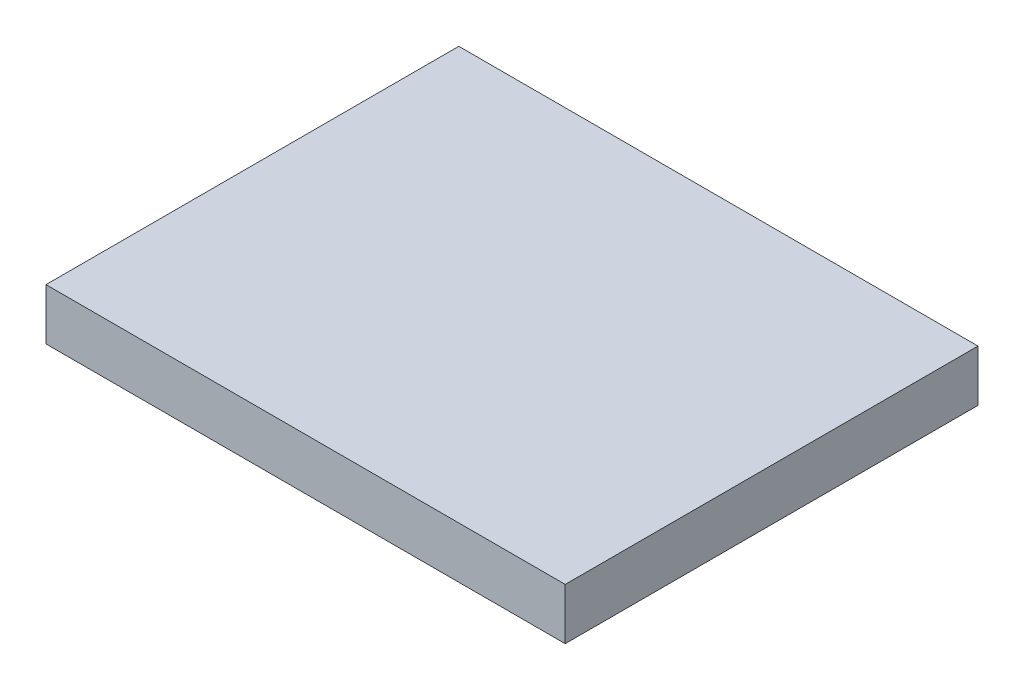
ISO-10303-21;
HEADER;
FILE_DESCRIPTION(('STEP AP214'),'2;1');
FILE_NAME('part.step','',(''),(''),'','','');
FILE_SCHEMA(('AUTOMOTIVE_DESIGN { 1 0 10303 214 1 1 1 1 }'));
ENDSEC;
DATA;
#1=APPLICATION_CONTEXT('core data for automotive mechanical design processes');
#2=APPLICATION_PROTOCOL_DEFINITION('international standard','automotive_design',2000,#1);
#3=PRODUCT_CONTEXT('',#1,'mechanical');
#4=PRODUCT('Part','Part','',(#3));
#5=PRODUCT_RELATED_PRODUCT_CATEGORY('part','',(#4));
#6=PRODUCT_DEFINITION_FORMATION('','',#4);
#7=PRODUCT_DEFINITION_CONTEXT('part definition',#1,'design');
#8=PRODUCT_DEFINITION('design','',#6,#7);
#9=PRODUCT_DEFINITION_SHAPE('','',#8);
#10=(LENGTH_UNIT() NAMED_UNIT(*) SI_UNIT(.MILLI.,.METRE.));
#11=(NAMED_UNIT(*) PLANE_ANGLE_UNIT() SI_UNIT($,.RADIAN.));
#12=(NAMED_UNIT(*) SI_UNIT($,.STERADIAN.) SOLID_ANGLE_UNIT());
#13=UNCERTAINTY_MEASURE_WITH_UNIT(LENGTH_MEASURE(1.E-05),#10,'distance_accuracy_value','');
#14=(GEOMETRIC_REPRESENTATION_CONTEXT(3) GLOBAL_UNCERTAINTY_ASSIGNED_CONTEXT((#13)) GLOBAL_UNIT_ASSIGNED_CONTEXT((#10,
#11,#12)) REPRESENTATION_CONTEXT('',''));
#15=CARTESIAN_POINT('',(0.,0.,0.));
#16=DIRECTION('',(0.,0.,1.));
#17=DIRECTION('',(1.,0.,0.));
#18=AXIS2_PLACEMENT_3D('',#15,#16,#17);
#19=CARTESIAN_POINT('',(0.,28.,0.));
#20=DIRECTION('',(1.,0.,0.));
#21=DIRECTION('',(0.,0.,-1.));
#22=AXIS2_PLACEMENT_3D('',#19,#20,#21);
#23=PLANE('',#22);
#24=DIRECTION('',(0.,0.,1.));
#25=VECTOR('',#24,1.);
#26=CARTESIAN_POINT('',(0.,0.,0.));
#27=LINE('',#26,#25);
#28=CARTESIAN_POINT('',(0.,0.,-225.));
#29=VERTEX_POINT('',#28);
#30=CARTESIAN_POINT('',(0.,0.,0.));
#31=VERTEX_POINT('',#30);
#32=EDGE_CURVE('E96',#29,#31,#27,.T.);
#33=ORIENTED_EDGE('',*,*,#32,.T.);
#34=DIRECTION('',(0.,-1.,0.));
#35=VECTOR('',#34,1.);
#36=CARTESIAN_POINT('',(0.,28.,0.));
#37=LINE('',#36,#35);
#38=CARTESIAN_POINT('',(0.,28.,0.));
#39=VERTEX_POINT('',#38);
#40=EDGE_CURVE('E11',#39,#31,#37,.T.);
#41=ORIENTED_EDGE('',*,*,#40,.F.);
#42=DIRECTION('',(0.,0.,1.));
#43=VECTOR('',#42,1.);
#44=CARTESIAN_POINT('',(0.,28.,0.));
#45=LINE('',#44,#43);
#46=CARTESIAN_POINT('',(0.,28.,-225.));
#47=VERTEX_POINT('',#46);
#48=EDGE_CURVE('E84',#47,#39,#45,.T.);
#49=ORIENTED_EDGE('',*,*,#48,.F.);
#50=DIRECTION('',(0.,-1.,0.));
#51=VECTOR('',#50,1.);
#52=CARTESIAN_POINT('',(0.,28.,-225.));
#53=LINE('',#52,#51);
#54=EDGE_CURVE('E92',#47,#29,#53,.T.);
#55=ORIENTED_EDGE('',*,*,#54,.T.);
#56=EDGE_LOOP('',(#33,#41,#49,#55));
#57=FACE_BOUND('',#56,.T.);
#58=ADVANCED_FACE('F33',(#57),#23,.F.);
#59=CARTESIAN_POINT('',(0.,28.,0.));
#60=DIRECTION('',(0.,0.,-1.));
#61=DIRECTION('',(-1.,0.,0.));
#62=AXIS2_PLACEMENT_3D('',#59,#60,#61);
#63=PLANE('',#62);
#64=DIRECTION('',(1.,0.,0.));
#65=VECTOR('',#64,1.);
#66=CARTESIAN_POINT('',(0.,0.,0.));
#67=LINE('',#66,#65);
#68=CARTESIAN_POINT('',(283.,0.,0.));
#69=VERTEX_POINT('',#68);
#70=EDGE_CURVE('E88',#31,#69,#67,.T.);
#71=ORIENTED_EDGE('',*,*,#70,.T.);
#72=DIRECTION('',(0.,-1.,0.));
#73=VECTOR('',#72,1.);
#74=CARTESIAN_POINT('',(283.,28.,0.));
#75=LINE('',#74,#73);
#76=CARTESIAN_POINT('',(283.,28.,0.));
#77=VERTEX_POINT('',#76);
#78=EDGE_CURVE('E41',#77,#69,#75,.T.);
#79=ORIENTED_EDGE('',*,*,#78,.F.);
#80=DIRECTION('',(1.,0.,0.));
#81=VECTOR('',#80,1.);
#82=CARTESIAN_POINT('',(0.,28.,0.));
#83=LINE('',#82,#81);
#84=EDGE_CURVE('E79',#39,#77,#83,.T.);
#85=ORIENTED_EDGE('',*,*,#84,.F.);
#86=ORIENTED_EDGE('',*,*,#40,.T.);
#87=EDGE_LOOP('',(#71,#79,#85,#86));
#88=FACE_BOUND('',#87,.T.);
#89=ADVANCED_FACE('F87',(#88),#63,.F.);
#90=CARTESIAN_POINT('',(283.,28.,0.));
#91=DIRECTION('',(-1.,0.,0.));
#92=DIRECTION('',(0.,0.,1.));
#93=AXIS2_PLACEMENT_3D('',#90,#91,#92);
#94=PLANE('',#93);
#95=DIRECTION('',(0.,0.,-1.));
#96=VECTOR('',#95,1.);
#97=CARTESIAN_POINT('',(283.,0.,0.));
#98=LINE('',#97,#96);
#99=CARTESIAN_POINT('',(283.,0.,-225.));
#100=VERTEX_POINT('',#99);
#101=EDGE_CURVE('E66',#69,#100,#98,.T.);
#102=ORIENTED_EDGE('',*,*,#101,.T.);
#103=DIRECTION('',(0.,-1.,0.));
#104=VECTOR('',#103,1.);
#105=CARTESIAN_POINT('',(283.,28.,-225.));
#106=LINE('',#105,#104);
#107=CARTESIAN_POINT('',(283.,28.,-225.));
#108=VERTEX_POINT('',#107);
#109=EDGE_CURVE('E89',#108,#100,#106,.T.);
#110=ORIENTED_EDGE('',*,*,#109,.F.);
#111=DIRECTION('',(0.,0.,-1.));
#112=VECTOR('',#111,1.);
#113=CARTESIAN_POINT('',(283.,28.,0.));
#114=LINE('',#113,#112);
#115=EDGE_CURVE('E82',#77,#108,#114,.T.);
#116=ORIENTED_EDGE('',*,*,#115,.F.);
#117=ORIENTED_EDGE('',*,*,#78,.T.);
#118=EDGE_LOOP('',(#102,#110,#116,#117));
#119=FACE_BOUND('',#118,.T.);
#120=ADVANCED_FACE('F90',(#119),#94,.F.);
#121=CARTESIAN_POINT('',(0.,28.,-225.));
#122=DIRECTION('',(0.,0.,1.));
#123=DIRECTION('',(1.,0.,0.));
#124=AXIS2_PLACEMENT_3D('',#121,#122,#123);
#125=PLANE('',#124);
#126=DIRECTION('',(-1.,0.,0.));
#127=VECTOR('',#126,1.);
#128=CARTESIAN_POINT('',(0.,0.,-225.));
#129=LINE('',#128,#127);
#130=EDGE_CURVE('E72',#100,#29,#129,.T.);
#131=ORIENTED_EDGE('',*,*,#130,.T.);
#132=ORIENTED_EDGE('',*,*,#54,.F.);
#133=DIRECTION('',(-1.,0.,0.));
#134=VECTOR('',#133,1.);
#135=CARTESIAN_POINT('',(0.,28.,-225.));
#136=LINE('',#135,#134);
#137=EDGE_CURVE('E49',#108,#47,#136,.T.);
#138=ORIENTED_EDGE('',*,*,#137,.F.);
#139=ORIENTED_EDGE('',*,*,#109,.T.);
#140=EDGE_LOOP('',(#131,#132,#138,#139));
#141=FACE_BOUND('',#140,.T.);
#142=ADVANCED_FACE('F103',(#141),#125,.F.);
#143=CARTESIAN_POINT('',(0.,28.,0.));
#144=DIRECTION('',(0.,-1.,0.));
#145=DIRECTION('',(0.,0.,-1.));
#146=AXIS2_PLACEMENT_3D('',#143,#144,#145);
#147=PLANE('',#146);
#148=ORIENTED_EDGE('',*,*,#48,.T.);
#149=ORIENTED_EDGE('',*,*,#84,.T.);
#150=ORIENTED_EDGE('',*,*,#115,.T.);
#151=ORIENTED_EDGE('',*,*,#137,.T.);
#152=EDGE_LOOP('',(#148,#149,#150,#151));
#153=FACE_BOUND('',#152,.T.);
#154=ADVANCED_FACE('F80',(#153),#147,.F.);
#155=CARTESIAN_POINT('',(0.,0.,0.));
#156=DIRECTION('',(0.,-1.,0.));
#157=DIRECTION('',(0.,0.,-1.));
#158=AXIS2_PLACEMENT_3D('',#155,#156,#157);
#159=PLANE('',#158);
#160=ORIENTED_EDGE('',*,*,#32,.F.);
#161=ORIENTED_EDGE('',*,*,#130,.F.);
#162=ORIENTED_EDGE('',*,*,#101,.F.);
#163=ORIENTED_EDGE('',*,*,#70,.F.);
#164=EDGE_LOOP('',(#160,#161,#162,#163));
#165=FACE_BOUND('',#164,.T.);
#166=ADVANCED_FACE('F106',(#165),#159,.T.);
#167=CLOSED_SHELL('',(#58,#89,#120,#142,#154,#166));
#168=MANIFOLD_SOLID_BREP('B2',#167);
#169=ADVANCED_BREP_SHAPE_REPRESENTATION('',(#18,#168),#14);
#170=SHAPE_DEFINITION_REPRESENTATION(#9,#169);
ENDSEC;
END-ISO-10303-21;
